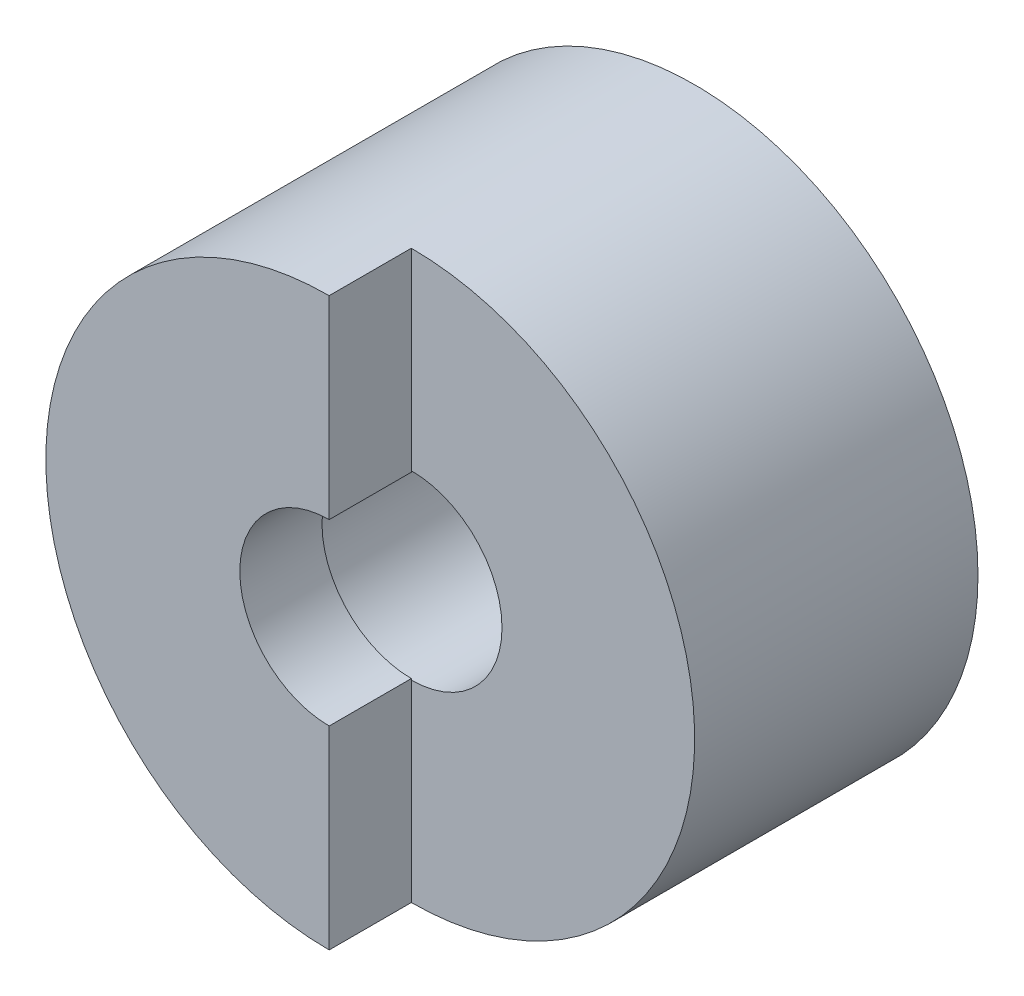
ISO-10303-21;
HEADER;
FILE_DESCRIPTION(('STEP AP214'),'2;1');
FILE_NAME('part.step','',(''),(''),'','','');
FILE_SCHEMA(('AUTOMOTIVE_DESIGN { 1 0 10303 214 1 1 1 1 }'));
ENDSEC;
DATA;
#1=APPLICATION_CONTEXT('core data for automotive mechanical design processes');
#2=APPLICATION_PROTOCOL_DEFINITION('international standard','automotive_design',2000,#1);
#3=PRODUCT_CONTEXT('',#1,'mechanical');
#4=PRODUCT('Part','Part','',(#3));
#5=PRODUCT_RELATED_PRODUCT_CATEGORY('part','',(#4));
#6=PRODUCT_DEFINITION_FORMATION('','',#4);
#7=PRODUCT_DEFINITION_CONTEXT('part definition',#1,'design');
#8=PRODUCT_DEFINITION('design','',#6,#7);
#9=PRODUCT_DEFINITION_SHAPE('','',#8);
#10=(LENGTH_UNIT() NAMED_UNIT(*) SI_UNIT(.MILLI.,.METRE.));
#11=(NAMED_UNIT(*) PLANE_ANGLE_UNIT() SI_UNIT($,.RADIAN.));
#12=(NAMED_UNIT(*) SI_UNIT($,.STERADIAN.) SOLID_ANGLE_UNIT());
#13=UNCERTAINTY_MEASURE_WITH_UNIT(LENGTH_MEASURE(1.E-05),#10,'distance_accuracy_value','');
#14=(GEOMETRIC_REPRESENTATION_CONTEXT(3) GLOBAL_UNCERTAINTY_ASSIGNED_CONTEXT((#13)) GLOBAL_UNIT_ASSIGNED_CONTEXT((#10,
#11,#12)) REPRESENTATION_CONTEXT('',''));
#15=CARTESIAN_POINT('',(0.,0.,0.));
#16=DIRECTION('',(0.,0.,1.));
#17=DIRECTION('',(1.,0.,0.));
#18=AXIS2_PLACEMENT_3D('',#15,#16,#17);
#19=CARTESIAN_POINT('',(0.,0.,5.));
#20=DIRECTION('',(0.,0.,1.));
#21=DIRECTION('',(1.,0.,0.));
#22=AXIS2_PLACEMENT_3D('',#19,#20,#21);
#23=PLANE('',#22);
#24=DIRECTION('',(0.,1.,0.));
#25=VECTOR('',#24,1.);
#26=CARTESIAN_POINT('',(0.,-1.57667856546078,5.));
#27=LINE('',#26,#25);
#28=CARTESIAN_POINT('',(0.,-5.,5.));
#29=VERTEX_POINT('',#28);
#30=CARTESIAN_POINT('',(0.,-1.6,5.));
#31=VERTEX_POINT('',#30);
#32=EDGE_CURVE('E109',#29,#31,#27,.T.);
#33=ORIENTED_EDGE('',*,*,#32,.F.);
#34=CARTESIAN_POINT('',(0.,0.,5.));
#35=DIRECTION('',(0.,0.,1.));
#36=DIRECTION('',(1.,0.,0.));
#37=AXIS2_PLACEMENT_3D('',#34,#35,#36);
#38=CIRCLE('',#37,5.);
#39=CARTESIAN_POINT('',(0.,5.,5.));
#40=VERTEX_POINT('',#39);
#41=EDGE_CURVE('E49',#29,#40,#38,.T.);
#42=ORIENTED_EDGE('',*,*,#41,.T.);
#43=DIRECTION('',(0.,1.,0.));
#44=VECTOR('',#43,1.);
#45=CARTESIAN_POINT('',(0.,1.57667856546078,5.));
#46=LINE('',#45,#44);
#47=CARTESIAN_POINT('',(0.,1.6,5.));
#48=VERTEX_POINT('',#47);
#49=EDGE_CURVE('E11',#48,#40,#46,.T.);
#50=ORIENTED_EDGE('',*,*,#49,.F.);
#51=CARTESIAN_POINT('',(0.,0.,5.));
#52=DIRECTION('',(0.,0.,1.));
#53=DIRECTION('',(1.,0.,0.));
#54=AXIS2_PLACEMENT_3D('',#51,#52,#53);
#55=CIRCLE('',#54,1.6);
#56=EDGE_CURVE('E58',#31,#48,#55,.T.);
#57=ORIENTED_EDGE('',*,*,#56,.F.);
#58=EDGE_LOOP('',(#33,#42,#50,#57));
#59=FACE_BOUND('',#58,.T.);
#60=ADVANCED_FACE('F39',(#59),#23,.T.);
#61=CARTESIAN_POINT('',(0.,0.,0.));
#62=DIRECTION('',(0.,0.,1.));
#63=DIRECTION('',(1.,0.,0.));
#64=AXIS2_PLACEMENT_3D('',#61,#62,#63);
#65=PLANE('',#64);
#66=CARTESIAN_POINT('',(0.,0.,0.));
#67=DIRECTION('',(0.,0.,1.));
#68=DIRECTION('',(1.,0.,0.));
#69=AXIS2_PLACEMENT_3D('',#66,#67,#68);
#70=CIRCLE('',#69,5.);
#71=CARTESIAN_POINT('',(5.,0.,0.));
#72=VERTEX_POINT('',#71);
#73=EDGE_CURVE('E43',#72,#72,#70,.T.);
#74=ORIENTED_EDGE('',*,*,#73,.F.);
#75=EDGE_LOOP('',(#74));
#76=FACE_BOUND('',#75,.T.);
#77=CARTESIAN_POINT('',(0.,0.,0.));
#78=DIRECTION('',(0.,0.,1.));
#79=DIRECTION('',(1.,0.,0.));
#80=AXIS2_PLACEMENT_3D('',#77,#78,#79);
#81=CIRCLE('',#80,1.6);
#82=CARTESIAN_POINT('',(1.6,0.,0.));
#83=VERTEX_POINT('',#82);
#84=EDGE_CURVE('E115',#83,#83,#81,.T.);
#85=ORIENTED_EDGE('',*,*,#84,.T.);
#86=EDGE_LOOP('',(#85));
#87=FACE_BOUND('',#86,.T.);
#88=ADVANCED_FACE('F134',(#76,#87),#65,.F.);
#89=CARTESIAN_POINT('',(0.,0.,5.));
#90=DIRECTION('',(0.,0.,-1.));
#91=DIRECTION('',(-1.,0.,0.));
#92=AXIS2_PLACEMENT_3D('',#89,#90,#91);
#93=CYLINDRICAL_SURFACE('',#92,5.);
#94=ORIENTED_EDGE('',*,*,#41,.F.);
#95=DIRECTION('',(0.,0.,-1.));
#96=VECTOR('',#95,1.);
#97=CARTESIAN_POINT('',(0.,-5.,6.45));
#98=LINE('',#97,#96);
#99=CARTESIAN_POINT('',(0.,-5.,6.45));
#100=VERTEX_POINT('',#99);
#101=EDGE_CURVE('E121',#100,#29,#98,.T.);
#102=ORIENTED_EDGE('',*,*,#101,.F.);
#103=CARTESIAN_POINT('',(0.,0.,6.45));
#104=DIRECTION('',(0.,0.,1.));
#105=DIRECTION('',(1.,0.,0.));
#106=AXIS2_PLACEMENT_3D('',#103,#104,#105);
#107=CIRCLE('',#106,5.);
#108=CARTESIAN_POINT('',(0.,5.,6.45));
#109=VERTEX_POINT('',#108);
#110=EDGE_CURVE('E98',#109,#100,#107,.T.);
#111=ORIENTED_EDGE('',*,*,#110,.F.);
#112=DIRECTION('',(0.,0.,-1.));
#113=VECTOR('',#112,1.);
#114=CARTESIAN_POINT('',(0.,5.,6.45));
#115=LINE('',#114,#113);
#116=EDGE_CURVE('E94',#109,#40,#115,.T.);
#117=ORIENTED_EDGE('',*,*,#116,.T.);
#118=EDGE_LOOP('',(#94,#102,#111,#117));
#119=FACE_BOUND('',#118,.T.);
#120=ORIENTED_EDGE('',*,*,#73,.T.);
#121=EDGE_LOOP('',(#120));
#122=FACE_BOUND('',#121,.T.);
#123=ADVANCED_FACE('F41',(#119,#122),#93,.T.);
#124=CARTESIAN_POINT('',(0.,0.,5.));
#125=DIRECTION('',(0.,0.,-1.));
#126=DIRECTION('',(-1.,0.,0.));
#127=AXIS2_PLACEMENT_3D('',#124,#125,#126);
#128=CYLINDRICAL_SURFACE('',#127,1.6);
#129=EDGE_CURVE('E125',#48,#31,#55,.T.);
#130=ORIENTED_EDGE('',*,*,#129,.T.);
#131=ORIENTED_EDGE('',*,*,#56,.T.);
#132=EDGE_LOOP('',(#130,#131));
#133=FACE_BOUND('',#132,.T.);
#134=ORIENTED_EDGE('',*,*,#84,.F.);
#135=EDGE_LOOP('',(#134));
#136=FACE_BOUND('',#135,.T.);
#137=ADVANCED_FACE('F139',(#133,#136),#128,.F.);
#138=CARTESIAN_POINT('',(0.,0.,6.45));
#139=DIRECTION('',(0.,0.,-1.));
#140=DIRECTION('',(-1.,0.,0.));
#141=AXIS2_PLACEMENT_3D('',#138,#139,#140);
#142=CYLINDRICAL_SURFACE('',#141,1.57667856546078);
#143=CARTESIAN_POINT('',(0.,0.,5.));
#144=DIRECTION('',(0.,0.,-1.));
#145=DIRECTION('',(1.,0.,0.));
#146=AXIS2_PLACEMENT_3D('',#143,#144,#145);
#147=CIRCLE('',#146,1.57667856546078);
#148=CARTESIAN_POINT('',(0.,-1.57667856546078,5.));
#149=VERTEX_POINT('',#148);
#150=CARTESIAN_POINT('',(0.,1.57667856546078,5.));
#151=VERTEX_POINT('',#150);
#152=EDGE_CURVE('E113',#149,#151,#147,.T.);
#153=ORIENTED_EDGE('',*,*,#152,.T.);
#154=DIRECTION('',(0.,0.,-1.));
#155=VECTOR('',#154,1.);
#156=CARTESIAN_POINT('',(0.,1.57667856546078,6.45));
#157=LINE('',#156,#155);
#158=CARTESIAN_POINT('',(0.,1.57667856546078,6.45));
#159=VERTEX_POINT('',#158);
#160=EDGE_CURVE('E91',#159,#151,#157,.T.);
#161=ORIENTED_EDGE('',*,*,#160,.F.);
#162=CARTESIAN_POINT('',(0.,0.,6.45));
#163=DIRECTION('',(0.,0.,-1.));
#164=DIRECTION('',(1.,0.,0.));
#165=AXIS2_PLACEMENT_3D('',#162,#163,#164);
#166=CIRCLE('',#165,1.57667856546078);
#167=CARTESIAN_POINT('',(0.,-1.57667856546078,6.45));
#168=VERTEX_POINT('',#167);
#169=EDGE_CURVE('E99',#168,#159,#166,.T.);
#170=ORIENTED_EDGE('',*,*,#169,.F.);
#171=DIRECTION('',(0.,0.,-1.));
#172=VECTOR('',#171,1.);
#173=CARTESIAN_POINT('',(0.,-1.57667856546078,6.45));
#174=LINE('',#173,#172);
#175=EDGE_CURVE('E162',#168,#149,#174,.T.);
#176=ORIENTED_EDGE('',*,*,#175,.T.);
#177=EDGE_LOOP('',(#153,#161,#170,#176));
#178=FACE_BOUND('',#177,.T.);
#179=ADVANCED_FACE('F111',(#178),#142,.F.);
#180=CARTESIAN_POINT('',(0.,1.57667856546078,6.45));
#181=DIRECTION('',(-1.,0.,0.));
#182=DIRECTION('',(0.,0.,1.));
#183=AXIS2_PLACEMENT_3D('',#180,#181,#182);
#184=PLANE('',#183);
#185=EDGE_CURVE('E51',#151,#48,#46,.T.);
#186=ORIENTED_EDGE('',*,*,#185,.T.);
#187=ORIENTED_EDGE('',*,*,#49,.T.);
#188=ORIENTED_EDGE('',*,*,#116,.F.);
#189=DIRECTION('',(0.,1.,0.));
#190=VECTOR('',#189,1.);
#191=CARTESIAN_POINT('',(0.,1.57667856546078,6.45));
#192=LINE('',#191,#190);
#193=EDGE_CURVE('E86',#159,#109,#192,.T.);
#194=ORIENTED_EDGE('',*,*,#193,.F.);
#195=ORIENTED_EDGE('',*,*,#160,.T.);
#196=EDGE_LOOP('',(#186,#187,#188,#194,#195));
#197=FACE_BOUND('',#196,.T.);
#198=ADVANCED_FACE('F89',(#197),#184,.F.);
#199=CARTESIAN_POINT('',(0.,-1.57667856546078,6.45));
#200=DIRECTION('',(-1.,0.,0.));
#201=DIRECTION('',(0.,0.,1.));
#202=AXIS2_PLACEMENT_3D('',#199,#200,#201);
#203=PLANE('',#202);
#204=ORIENTED_EDGE('',*,*,#32,.T.);
#205=EDGE_CURVE('E157',#31,#149,#27,.T.);
#206=ORIENTED_EDGE('',*,*,#205,.T.);
#207=ORIENTED_EDGE('',*,*,#175,.F.);
#208=DIRECTION('',(0.,1.,0.));
#209=VECTOR('',#208,1.);
#210=CARTESIAN_POINT('',(0.,-1.57667856546078,6.45));
#211=LINE('',#210,#209);
#212=EDGE_CURVE('E104',#100,#168,#211,.T.);
#213=ORIENTED_EDGE('',*,*,#212,.F.);
#214=ORIENTED_EDGE('',*,*,#101,.T.);
#215=EDGE_LOOP('',(#204,#206,#207,#213,#214));
#216=FACE_BOUND('',#215,.T.);
#217=ADVANCED_FACE('F160',(#216),#203,.F.);
#218=CARTESIAN_POINT('',(0.,0.,6.45));
#219=DIRECTION('',(0.,0.,1.));
#220=DIRECTION('',(1.,0.,0.));
#221=AXIS2_PLACEMENT_3D('',#218,#219,#220);
#222=PLANE('',#221);
#223=ORIENTED_EDGE('',*,*,#169,.T.);
#224=ORIENTED_EDGE('',*,*,#193,.T.);
#225=ORIENTED_EDGE('',*,*,#110,.T.);
#226=ORIENTED_EDGE('',*,*,#212,.T.);
#227=EDGE_LOOP('',(#223,#224,#225,#226));
#228=FACE_BOUND('',#227,.T.);
#229=ADVANCED_FACE('F102',(#228),#222,.T.);
#230=CARTESIAN_POINT('',(0.,0.,5.));
#231=DIRECTION('',(0.,0.,1.));
#232=DIRECTION('',(1.,0.,0.));
#233=AXIS2_PLACEMENT_3D('',#230,#231,#232);
#234=PLANE('',#233);
#235=ORIENTED_EDGE('',*,*,#129,.F.);
#236=ORIENTED_EDGE('',*,*,#185,.F.);
#237=ORIENTED_EDGE('',*,*,#152,.F.);
#238=ORIENTED_EDGE('',*,*,#205,.F.);
#239=EDGE_LOOP('',(#235,#236,#237,#238));
#240=FACE_BOUND('',#239,.T.);
#241=ADVANCED_FACE('F176',(#240),#234,.F.);
#242=CLOSED_SHELL('',(#60,#88,#123,#137,#179,#198,#217,#229,#241));
#243=MANIFOLD_SOLID_BREP('B2',#242);
#244=ADVANCED_BREP_SHAPE_REPRESENTATION('',(#18,#243),#14);
#245=SHAPE_DEFINITION_REPRESENTATION(#9,#244);
ENDSEC;
END-ISO-10303-21;
